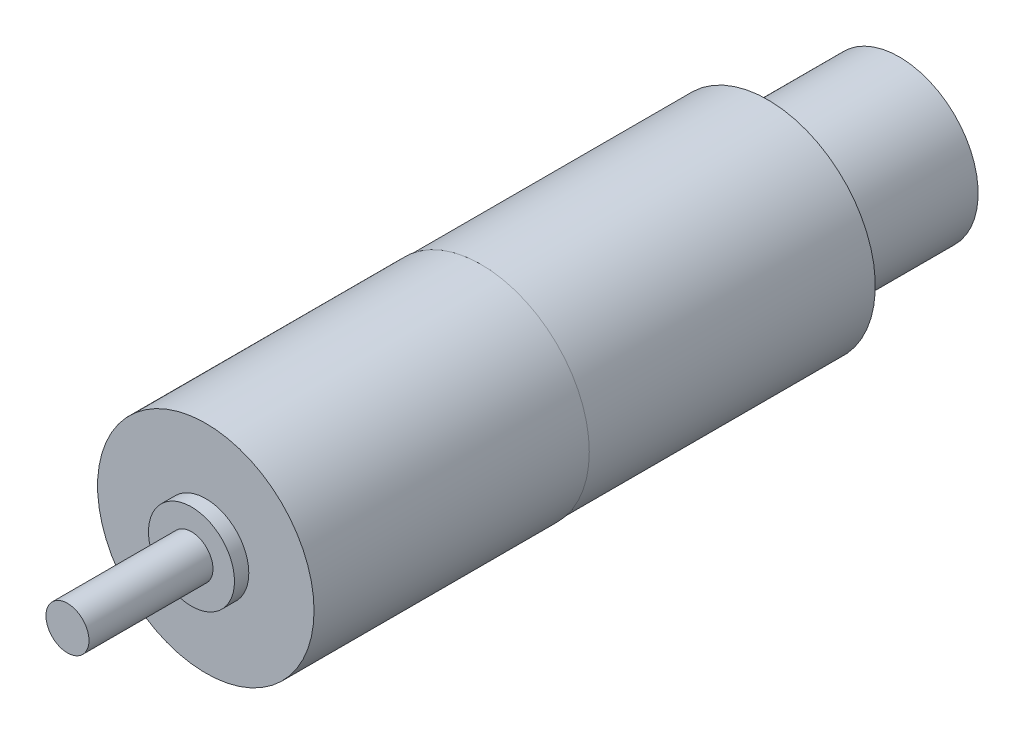
ISO-10303-21;
HEADER;
FILE_DESCRIPTION(('STEP AP214'),'2;1');
FILE_NAME('part.step','',(''),(''),'','','');
FILE_SCHEMA(('AUTOMOTIVE_DESIGN { 1 0 10303 214 1 1 1 1 }'));
ENDSEC;
DATA;
#1=APPLICATION_CONTEXT('core data for automotive mechanical design processes');
#2=APPLICATION_PROTOCOL_DEFINITION('international standard','automotive_design',2000,#1);
#3=PRODUCT_CONTEXT('',#1,'mechanical');
#4=PRODUCT('Part','Part','',(#3));
#5=PRODUCT_RELATED_PRODUCT_CATEGORY('part','',(#4));
#6=PRODUCT_DEFINITION_FORMATION('','',#4);
#7=PRODUCT_DEFINITION_CONTEXT('part definition',#1,'design');
#8=PRODUCT_DEFINITION('design','',#6,#7);
#9=PRODUCT_DEFINITION_SHAPE('','',#8);
#10=(LENGTH_UNIT() NAMED_UNIT(*) SI_UNIT(.MILLI.,.METRE.));
#11=(NAMED_UNIT(*) PLANE_ANGLE_UNIT() SI_UNIT($,.RADIAN.));
#12=(NAMED_UNIT(*) SI_UNIT($,.STERADIAN.) SOLID_ANGLE_UNIT());
#13=UNCERTAINTY_MEASURE_WITH_UNIT(LENGTH_MEASURE(1.E-05),#10,'distance_accuracy_value','');
#14=(GEOMETRIC_REPRESENTATION_CONTEXT(3) GLOBAL_UNCERTAINTY_ASSIGNED_CONTEXT((#13)) GLOBAL_UNIT_ASSIGNED_CONTEXT((#10,
#11,#12)) REPRESENTATION_CONTEXT('',''));
#15=CARTESIAN_POINT('',(0.,0.,0.));
#16=DIRECTION('',(0.,0.,1.));
#17=DIRECTION('',(1.,0.,0.));
#18=AXIS2_PLACEMENT_3D('',#15,#16,#17);
#19=CARTESIAN_POINT('',(0.,0.,57.7));
#20=DIRECTION('',(0.,0.,-1.));
#21=DIRECTION('',(-1.,0.,0.));
#22=AXIS2_PLACEMENT_3D('',#19,#20,#21);
#23=CYLINDRICAL_SURFACE('',#22,3.);
#24=CARTESIAN_POINT('',(0.,0.,57.7));
#25=DIRECTION('',(0.,0.,1.));
#26=DIRECTION('',(1.,0.,0.));
#27=AXIS2_PLACEMENT_3D('',#24,#25,#26);
#28=CIRCLE('',#27,3.);
#29=CARTESIAN_POINT('',(3.,0.,57.7));
#30=VERTEX_POINT('',#29);
#31=EDGE_CURVE('E11',#30,#30,#28,.T.);
#32=ORIENTED_EDGE('',*,*,#31,.F.);
#33=EDGE_LOOP('',(#32));
#34=FACE_BOUND('',#33,.T.);
#35=CARTESIAN_POINT('',(0.,0.,40.4));
#36=DIRECTION('',(0.,0.,1.));
#37=DIRECTION('',(1.,0.,0.));
#38=AXIS2_PLACEMENT_3D('',#35,#36,#37);
#39=CIRCLE('',#38,3.);
#40=CARTESIAN_POINT('',(3.,0.,40.4));
#41=VERTEX_POINT('',#40);
#42=EDGE_CURVE('E49',#41,#41,#39,.T.);
#43=ORIENTED_EDGE('',*,*,#42,.T.);
#44=EDGE_LOOP('',(#43));
#45=FACE_BOUND('',#44,.T.);
#46=ADVANCED_FACE('F46',(#34,#45),#23,.T.);
#47=CARTESIAN_POINT('',(0.,0.,57.7));
#48=DIRECTION('',(0.,0.,1.));
#49=DIRECTION('',(1.,0.,0.));
#50=AXIS2_PLACEMENT_3D('',#47,#48,#49);
#51=PLANE('',#50);
#52=ORIENTED_EDGE('',*,*,#31,.T.);
#53=EDGE_LOOP('',(#52));
#54=FACE_BOUND('',#53,.T.);
#55=ADVANCED_FACE('F61',(#54),#51,.T.);
#56=CARTESIAN_POINT('',(0.,0.,40.4));
#57=DIRECTION('',(0.,0.,1.));
#58=DIRECTION('',(1.,0.,0.));
#59=AXIS2_PLACEMENT_3D('',#56,#57,#58);
#60=PLANE('',#59);
#61=ORIENTED_EDGE('',*,*,#42,.F.);
#62=EDGE_LOOP('',(#61));
#63=FACE_BOUND('',#62,.T.);
#64=ADVANCED_FACE('F59',(#63),#60,.F.);
#65=CLOSED_SHELL('',(#46,#55,#64));
#66=MANIFOLD_SOLID_BREP('B2',#65);
#67=CARTESIAN_POINT('',(0.,0.,-58.35));
#68=DIRECTION('',(0.,0.,1.));
#69=DIRECTION('',(1.,0.,0.));
#70=AXIS2_PLACEMENT_3D('',#67,#68,#69);
#71=CYLINDRICAL_SURFACE('',#70,11.);
#72=CARTESIAN_POINT('',(0.,0.,-58.35));
#73=DIRECTION('',(0.,0.,-1.));
#74=DIRECTION('',(-1.,0.,0.));
#75=AXIS2_PLACEMENT_3D('',#72,#73,#74);
#76=CIRCLE('',#75,11.);
#77=CARTESIAN_POINT('',(-11.,0.,-58.35));
#78=VERTEX_POINT('',#77);
#79=EDGE_CURVE('E45',#78,#78,#76,.T.);
#80=ORIENTED_EDGE('',*,*,#79,.F.);
#81=EDGE_LOOP('',(#80));
#82=FACE_BOUND('',#81,.T.);
#83=CARTESIAN_POINT('',(0.,0.,-40.));
#84=DIRECTION('',(0.,0.,-1.));
#85=DIRECTION('',(-1.,0.,0.));
#86=AXIS2_PLACEMENT_3D('',#83,#84,#85);
#87=CIRCLE('',#86,11.);
#88=CARTESIAN_POINT('',(-11.,0.,-40.));
#89=VERTEX_POINT('',#88);
#90=EDGE_CURVE('E98',#89,#89,#87,.T.);
#91=ORIENTED_EDGE('',*,*,#90,.T.);
#92=EDGE_LOOP('',(#91));
#93=FACE_BOUND('',#92,.T.);
#94=ADVANCED_FACE('F95',(#82,#93),#71,.T.);
#95=CARTESIAN_POINT('',(0.,0.,-58.35));
#96=DIRECTION('',(0.,0.,-1.));
#97=DIRECTION('',(-1.,0.,0.));
#98=AXIS2_PLACEMENT_3D('',#95,#96,#97);
#99=PLANE('',#98);
#100=ORIENTED_EDGE('',*,*,#79,.T.);
#101=EDGE_LOOP('',(#100));
#102=FACE_BOUND('',#101,.T.);
#103=ADVANCED_FACE('F110',(#102),#99,.T.);
#104=CARTESIAN_POINT('',(0.,0.,-40.));
#105=DIRECTION('',(0.,0.,-1.));
#106=DIRECTION('',(-1.,0.,0.));
#107=AXIS2_PLACEMENT_3D('',#104,#105,#106);
#108=PLANE('',#107);
#109=ORIENTED_EDGE('',*,*,#90,.F.);
#110=EDGE_LOOP('',(#109));
#111=FACE_BOUND('',#110,.T.);
#112=ADVANCED_FACE('F108',(#111),#108,.F.);
#113=CLOSED_SHELL('',(#94,#103,#112));
#114=MANIFOLD_SOLID_BREP('B6',#113);
#115=CARTESIAN_POINT('',(0.,0.,-40.));
#116=DIRECTION('',(0.,0.,1.));
#117=DIRECTION('',(1.,0.,0.));
#118=AXIS2_PLACEMENT_3D('',#115,#116,#117);
#119=CYLINDRICAL_SURFACE('',#118,15.);
#120=CARTESIAN_POINT('',(0.,0.,-40.));
#121=DIRECTION('',(0.,0.,-1.));
#122=DIRECTION('',(-1.,0.,0.));
#123=AXIS2_PLACEMENT_3D('',#120,#121,#122);
#124=CIRCLE('',#123,15.);
#125=CARTESIAN_POINT('',(-15.,0.,-40.));
#126=VERTEX_POINT('',#125);
#127=EDGE_CURVE('E94',#126,#126,#124,.T.);
#128=ORIENTED_EDGE('',*,*,#127,.F.);
#129=EDGE_LOOP('',(#128));
#130=FACE_BOUND('',#129,.T.);
#131=CARTESIAN_POINT('',(0.,0.,0.));
#132=DIRECTION('',(0.,0.,-1.));
#133=DIRECTION('',(-1.,0.,0.));
#134=AXIS2_PLACEMENT_3D('',#131,#132,#133);
#135=CIRCLE('',#134,15.);
#136=CARTESIAN_POINT('',(-15.,0.,0.));
#137=VERTEX_POINT('',#136);
#138=EDGE_CURVE('E146',#137,#137,#135,.T.);
#139=ORIENTED_EDGE('',*,*,#138,.T.);
#140=EDGE_LOOP('',(#139));
#141=FACE_BOUND('',#140,.T.);
#142=ADVANCED_FACE('F143',(#130,#141),#119,.T.);
#143=CARTESIAN_POINT('',(0.,0.,-40.));
#144=DIRECTION('',(0.,0.,-1.));
#145=DIRECTION('',(-1.,0.,0.));
#146=AXIS2_PLACEMENT_3D('',#143,#144,#145);
#147=PLANE('',#146);
#148=ORIENTED_EDGE('',*,*,#127,.T.);
#149=EDGE_LOOP('',(#148));
#150=FACE_BOUND('',#149,.T.);
#151=ADVANCED_FACE('F158',(#150),#147,.T.);
#152=CARTESIAN_POINT('',(0.,0.,0.));
#153=DIRECTION('',(0.,0.,-1.));
#154=DIRECTION('',(-1.,0.,0.));
#155=AXIS2_PLACEMENT_3D('',#152,#153,#154);
#156=PLANE('',#155);
#157=ORIENTED_EDGE('',*,*,#138,.F.);
#158=EDGE_LOOP('',(#157));
#159=FACE_BOUND('',#158,.T.);
#160=ADVANCED_FACE('F156',(#159),#156,.F.);
#161=CLOSED_SHELL('',(#142,#151,#160));
#162=MANIFOLD_SOLID_BREP('B40',#161);
#163=CARTESIAN_POINT('',(0.,0.,38.4));
#164=DIRECTION('',(0.,0.,-1.));
#165=DIRECTION('',(-1.,0.,0.));
#166=AXIS2_PLACEMENT_3D('',#163,#164,#165);
#167=CYLINDRICAL_SURFACE('',#166,15.1);
#168=CARTESIAN_POINT('',(0.,0.,38.4));
#169=DIRECTION('',(0.,0.,1.));
#170=DIRECTION('',(1.,0.,0.));
#171=AXIS2_PLACEMENT_3D('',#168,#169,#170);
#172=CIRCLE('',#171,15.1);
#173=CARTESIAN_POINT('',(15.1,0.,38.4));
#174=VERTEX_POINT('',#173);
#175=EDGE_CURVE('E191',#174,#174,#172,.T.);
#176=ORIENTED_EDGE('',*,*,#175,.F.);
#177=EDGE_LOOP('',(#176));
#178=FACE_BOUND('',#177,.T.);
#179=CARTESIAN_POINT('',(0.,0.,0.));
#180=DIRECTION('',(0.,0.,1.));
#181=DIRECTION('',(1.,0.,0.));
#182=AXIS2_PLACEMENT_3D('',#179,#180,#181);
#183=CIRCLE('',#182,15.1);
#184=CARTESIAN_POINT('',(15.1,0.,0.));
#185=VERTEX_POINT('',#184);
#186=EDGE_CURVE('E187',#185,#185,#183,.T.);
#187=ORIENTED_EDGE('',*,*,#186,.T.);
#188=EDGE_LOOP('',(#187));
#189=FACE_BOUND('',#188,.T.);
#190=ADVANCED_FACE('F184',(#178,#189),#167,.T.);
#191=CARTESIAN_POINT('',(0.,0.,38.4));
#192=DIRECTION('',(0.,0.,1.));
#193=DIRECTION('',(1.,0.,0.));
#194=AXIS2_PLACEMENT_3D('',#191,#192,#193);
#195=PLANE('',#194);
#196=CARTESIAN_POINT('',(0.,0.,38.4));
#197=DIRECTION('',(0.,0.,1.));
#198=DIRECTION('',(1.,0.,0.));
#199=AXIS2_PLACEMENT_3D('',#196,#197,#198);
#200=CIRCLE('',#199,6.);
#201=CARTESIAN_POINT('',(6.,0.,38.4));
#202=VERTEX_POINT('',#201);
#203=EDGE_CURVE('E142',#202,#202,#200,.T.);
#204=ORIENTED_EDGE('',*,*,#203,.F.);
#205=EDGE_LOOP('',(#204));
#206=FACE_BOUND('',#205,.T.);
#207=ORIENTED_EDGE('',*,*,#175,.T.);
#208=EDGE_LOOP('',(#207));
#209=FACE_BOUND('',#208,.T.);
#210=ADVANCED_FACE('F208',(#206,#209),#195,.T.);
#211=CARTESIAN_POINT('',(0.,0.,0.));
#212=DIRECTION('',(0.,0.,1.));
#213=DIRECTION('',(1.,0.,0.));
#214=AXIS2_PLACEMENT_3D('',#211,#212,#213);
#215=PLANE('',#214);
#216=ORIENTED_EDGE('',*,*,#186,.F.);
#217=EDGE_LOOP('',(#216));
#218=FACE_BOUND('',#217,.T.);
#219=ADVANCED_FACE('F205',(#218),#215,.F.);
#220=CARTESIAN_POINT('',(0.,0.,40.4));
#221=DIRECTION('',(0.,0.,-1.));
#222=DIRECTION('',(-1.,0.,0.));
#223=AXIS2_PLACEMENT_3D('',#220,#221,#222);
#224=CYLINDRICAL_SURFACE('',#223,6.);
#225=CARTESIAN_POINT('',(0.,0.,40.4));
#226=DIRECTION('',(0.,0.,1.));
#227=DIRECTION('',(1.,0.,0.));
#228=AXIS2_PLACEMENT_3D('',#225,#226,#227);
#229=CIRCLE('',#228,6.);
#230=CARTESIAN_POINT('',(6.,0.,40.4));
#231=VERTEX_POINT('',#230);
#232=EDGE_CURVE('E197',#231,#231,#229,.T.);
#233=ORIENTED_EDGE('',*,*,#232,.F.);
#234=EDGE_LOOP('',(#233));
#235=FACE_BOUND('',#234,.T.);
#236=ORIENTED_EDGE('',*,*,#203,.T.);
#237=EDGE_LOOP('',(#236));
#238=FACE_BOUND('',#237,.T.);
#239=ADVANCED_FACE('F207',(#235,#238),#224,.T.);
#240=CARTESIAN_POINT('',(0.,0.,40.4));
#241=DIRECTION('',(0.,0.,1.));
#242=DIRECTION('',(1.,0.,0.));
#243=AXIS2_PLACEMENT_3D('',#240,#241,#242);
#244=PLANE('',#243);
#245=ORIENTED_EDGE('',*,*,#232,.T.);
#246=EDGE_LOOP('',(#245));
#247=FACE_BOUND('',#246,.T.);
#248=ADVANCED_FACE('F213',(#247),#244,.T.);
#249=CLOSED_SHELL('',(#190,#210,#219,#239,#248));
#250=MANIFOLD_SOLID_BREP('B89',#249);
#251=ADVANCED_BREP_SHAPE_REPRESENTATION('',(#18,#66,#114,#162,#250),#14);
#252=SHAPE_DEFINITION_REPRESENTATION(#9,#251);
ENDSEC;
END-ISO-10303-21;
